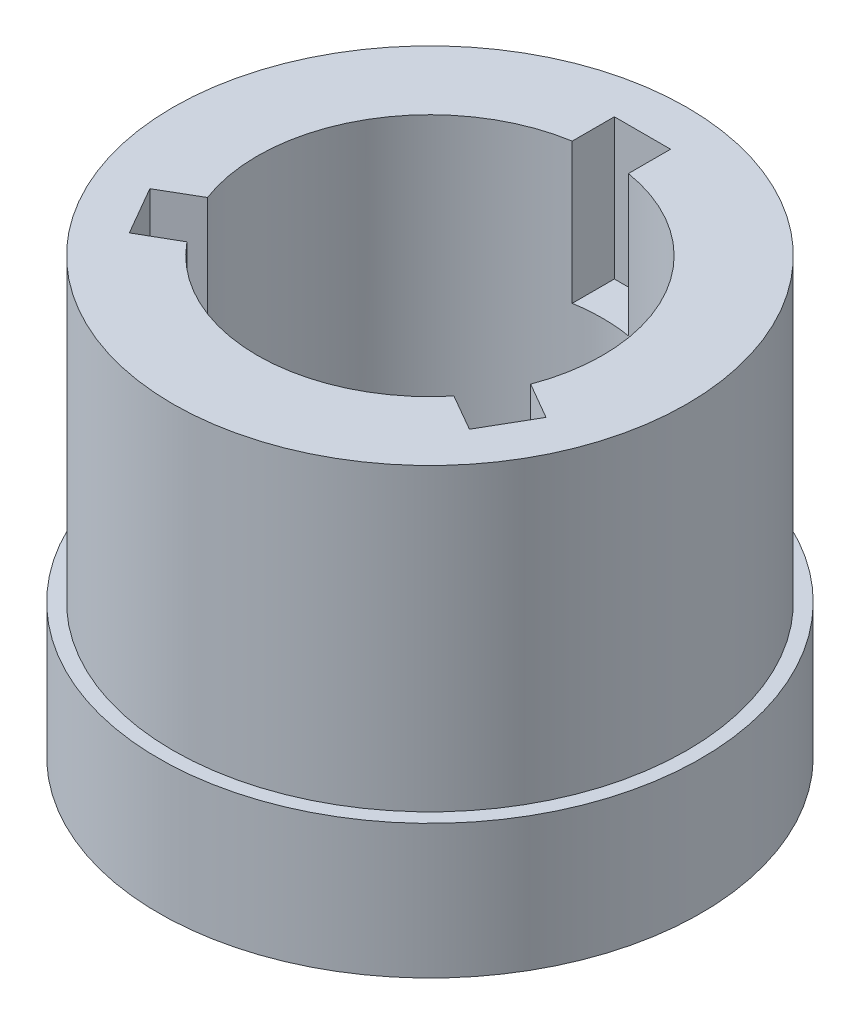
ISO-10303-21;
HEADER;
FILE_DESCRIPTION(('STEP AP214'),'2;1');
FILE_NAME('part.step','',(''),(''),'','','');
FILE_SCHEMA(('AUTOMOTIVE_DESIGN { 1 0 10303 214 1 1 1 1 }'));
ENDSEC;
DATA;
#1=APPLICATION_CONTEXT('core data for automotive mechanical design processes');
#2=APPLICATION_PROTOCOL_DEFINITION('international standard','automotive_design',2000,#1);
#3=PRODUCT_CONTEXT('',#1,'mechanical');
#4=PRODUCT('Part','Part','',(#3));
#5=PRODUCT_RELATED_PRODUCT_CATEGORY('part','',(#4));
#6=PRODUCT_DEFINITION_FORMATION('','',#4);
#7=PRODUCT_DEFINITION_CONTEXT('part definition',#1,'design');
#8=PRODUCT_DEFINITION('design','',#6,#7);
#9=PRODUCT_DEFINITION_SHAPE('','',#8);
#10=(LENGTH_UNIT() NAMED_UNIT(*) SI_UNIT(.MILLI.,.METRE.));
#11=(NAMED_UNIT(*) PLANE_ANGLE_UNIT() SI_UNIT($,.RADIAN.));
#12=(NAMED_UNIT(*) SI_UNIT($,.STERADIAN.) SOLID_ANGLE_UNIT());
#13=UNCERTAINTY_MEASURE_WITH_UNIT(LENGTH_MEASURE(1.E-05),#10,'distance_accuracy_value','');
#14=(GEOMETRIC_REPRESENTATION_CONTEXT(3) GLOBAL_UNCERTAINTY_ASSIGNED_CONTEXT((#13)) GLOBAL_UNIT_ASSIGNED_CONTEXT((#10,
#11,#12)) REPRESENTATION_CONTEXT('',''));
#15=CARTESIAN_POINT('',(0.,0.,0.));
#16=DIRECTION('',(0.,0.,1.));
#17=DIRECTION('',(1.,0.,0.));
#18=AXIS2_PLACEMENT_3D('',#15,#16,#17);
#19=CARTESIAN_POINT('',(0.,-29.4383234168354,0.));
#20=DIRECTION('',(0.,-1.,0.));
#21=DIRECTION('',(0.,0.,-1.));
#22=AXIS2_PLACEMENT_3D('',#19,#20,#21);
#23=DEGENERATE_TOROIDAL_SURFACE('',#22,14.4033473019353,16.3209518177761,.T.);
#24=CARTESIAN_POINT('',(0.,-29.4383234168354,0.));
#25=DIRECTION('',(0.,-1.,0.));
#26=DIRECTION('',(0.,0.,-1.));
#27=AXIS2_PLACEMENT_3D('',#24,#25,#26);
#28=CIRCLE('',#27,30.7242991197115);
#29=CARTESIAN_POINT('',(0.,-29.4383234168354,-30.7242991197115));
#30=VERTEX_POINT('',#29);
#31=EDGE_CURVE('E11',#30,#30,#28,.T.);
#32=ORIENTED_EDGE('',*,*,#31,.F.);
#33=EDGE_LOOP('',(#32));
#34=FACE_BOUND('',#33,.T.);
#35=CARTESIAN_POINT('',(0.,-43.1701942750485,0.));
#36=DIRECTION('',(0.,-1.,0.));
#37=DIRECTION('',(0.,0.,-1.));
#38=AXIS2_PLACEMENT_3D('',#35,#36,#37);
#39=CIRCLE('',#38,23.2242991197115);
#40=CARTESIAN_POINT('',(0.,-43.1701942750485,-23.2242991197115));
#41=VERTEX_POINT('',#40);
#42=EDGE_CURVE('E262',#41,#41,#39,.T.);
#43=ORIENTED_EDGE('',*,*,#42,.T.);
#44=EDGE_LOOP('',(#43));
#45=FACE_BOUND('',#44,.T.);
#46=ADVANCED_FACE('F45',(#34,#45),#23,.F.);
#47=CARTESIAN_POINT('',(0.,0.,0.));
#48=DIRECTION('',(0.,-1.,0.));
#49=DIRECTION('',(0.,0.,-1.));
#50=AXIS2_PLACEMENT_3D('',#47,#48,#49);
#51=CYLINDRICAL_SURFACE('',#50,30.7242991197115);
#52=CARTESIAN_POINT('',(0.,41.8298057249515,0.));
#53=DIRECTION('',(0.,1.,0.));
#54=DIRECTION('',(0.,0.,1.));
#55=AXIS2_PLACEMENT_3D('',#52,#53,#54);
#56=CIRCLE('',#55,30.7242991197115);
#57=CARTESIAN_POINT('',(28.7533220240434,41.8298057249515,10.8272355187814));
#58=VERTEX_POINT('',#57);
#59=CARTESIAN_POINT('',(4.99999999999999,41.8298057249515,-30.3147250754069));
#60=VERTEX_POINT('',#59);
#61=EDGE_CURVE('E261',#58,#60,#56,.T.);
#62=ORIENTED_EDGE('',*,*,#61,.T.);
#63=DIRECTION('',(0.,1.,0.));
#64=VECTOR('',#63,1.);
#65=CARTESIAN_POINT('',(4.99999999999999,16.8298057249515,-30.3147250754069));
#66=LINE('',#65,#64);
#67=CARTESIAN_POINT('',(4.99999999999999,16.8298057249515,-30.3147250754069));
#68=VERTEX_POINT('',#67);
#69=EDGE_CURVE('E176',#68,#60,#66,.T.);
#70=ORIENTED_EDGE('',*,*,#69,.F.);
#71=CARTESIAN_POINT('',(0.,16.8298057249515,0.));
#72=DIRECTION('',(0.,-1.,0.));
#73=DIRECTION('',(0.,0.,1.));
#74=AXIS2_PLACEMENT_3D('',#71,#72,#73);
#75=CIRCLE('',#74,30.7242991197115);
#76=CARTESIAN_POINT('',(-5.00000000000001,16.8298057249515,-30.3147250754069));
#77=VERTEX_POINT('',#76);
#78=EDGE_CURVE('E151',#77,#68,#75,.T.);
#79=ORIENTED_EDGE('',*,*,#78,.F.);
#80=DIRECTION('',(0.,1.,0.));
#81=VECTOR('',#80,1.);
#82=CARTESIAN_POINT('',(-5.00000000000001,16.8298057249515,-30.3147250754069));
#83=LINE('',#82,#81);
#84=CARTESIAN_POINT('',(-5.00000000000001,41.8298057249515,-30.3147250754069));
#85=VERTEX_POINT('',#84);
#86=EDGE_CURVE('E141',#77,#85,#83,.T.);
#87=ORIENTED_EDGE('',*,*,#86,.T.);
#88=CARTESIAN_POINT('',(-28.7533220240436,41.8298057249515,10.827235518781));
#89=VERTEX_POINT('',#88);
#90=EDGE_CURVE('E260',#85,#89,#56,.T.);
#91=ORIENTED_EDGE('',*,*,#90,.T.);
#92=DIRECTION('',(0.,1.,0.));
#93=VECTOR('',#92,1.);
#94=CARTESIAN_POINT('',(-28.7533220240436,16.8298057249515,10.827235518781));
#95=LINE('',#94,#93);
#96=CARTESIAN_POINT('',(-28.7533220240436,16.8298057249515,10.827235518781));
#97=VERTEX_POINT('',#96);
#98=EDGE_CURVE('E181',#97,#89,#95,.T.);
#99=ORIENTED_EDGE('',*,*,#98,.F.);
#100=CARTESIAN_POINT('',(0.,16.8298057249515,0.));
#101=DIRECTION('',(0.,-1.,0.));
#102=DIRECTION('',(0.,0.,1.));
#103=AXIS2_PLACEMENT_3D('',#100,#101,#102);
#104=CIRCLE('',#103,30.7242991197115);
#105=CARTESIAN_POINT('',(-23.7533220240437,16.8298057249515,19.4874895566254));
#106=VERTEX_POINT('',#105);
#107=EDGE_CURVE('E199',#106,#97,#104,.T.);
#108=ORIENTED_EDGE('',*,*,#107,.F.);
#109=DIRECTION('',(0.,1.,0.));
#110=VECTOR('',#109,1.);
#111=CARTESIAN_POINT('',(-23.7533220240437,16.8298057249515,19.4874895566254));
#112=LINE('',#111,#110);
#113=CARTESIAN_POINT('',(-23.7533220240437,41.8298057249515,19.4874895566254));
#114=VERTEX_POINT('',#113);
#115=EDGE_CURVE('E191',#106,#114,#112,.T.);
#116=ORIENTED_EDGE('',*,*,#115,.T.);
#117=CARTESIAN_POINT('',(23.7533220240434,41.8298057249515,19.4874895566257));
#118=VERTEX_POINT('',#117);
#119=EDGE_CURVE('E175',#114,#118,#56,.T.);
#120=ORIENTED_EDGE('',*,*,#119,.T.);
#121=DIRECTION('',(0.,1.,0.));
#122=VECTOR('',#121,1.);
#123=CARTESIAN_POINT('',(23.7533220240434,16.8298057249515,19.4874895566257));
#124=LINE('',#123,#122);
#125=CARTESIAN_POINT('',(23.7533220240434,16.8298057249515,19.4874895566257));
#126=VERTEX_POINT('',#125);
#127=EDGE_CURVE('E228',#126,#118,#124,.T.);
#128=ORIENTED_EDGE('',*,*,#127,.F.);
#129=CARTESIAN_POINT('',(0.,16.8298057249515,0.));
#130=DIRECTION('',(0.,-1.,0.));
#131=DIRECTION('',(0.,0.,1.));
#132=AXIS2_PLACEMENT_3D('',#129,#130,#131);
#133=CIRCLE('',#132,30.7242991197115);
#134=CARTESIAN_POINT('',(28.7533220240434,16.8298057249515,10.8272355187814));
#135=VERTEX_POINT('',#134);
#136=EDGE_CURVE('E247',#135,#126,#133,.T.);
#137=ORIENTED_EDGE('',*,*,#136,.F.);
#138=DIRECTION('',(0.,1.,0.));
#139=VECTOR('',#138,1.);
#140=CARTESIAN_POINT('',(28.7533220240434,16.8298057249515,10.8272355187814));
#141=LINE('',#140,#139);
#142=EDGE_CURVE('E224',#135,#58,#141,.T.);
#143=ORIENTED_EDGE('',*,*,#142,.T.);
#144=EDGE_LOOP('',(#62,#70,#79,#87,#91,#99,#108,#116,#120,#128,#137,#143));
#145=FACE_BOUND('',#144,.T.);
#146=ORIENTED_EDGE('',*,*,#31,.T.);
#147=EDGE_LOOP('',(#146));
#148=FACE_BOUND('',#147,.T.);
#149=ADVANCED_FACE('F290',(#145,#148),#51,.F.);
#150=CARTESIAN_POINT('',(-45.7242991197115,41.8298057249515,0.));
#151=DIRECTION('',(0.,-1.,0.));
#152=DIRECTION('',(0.,0.,-1.));
#153=AXIS2_PLACEMENT_3D('',#150,#151,#152);
#154=PLANE('',#153);
#155=CARTESIAN_POINT('',(0.,41.8298057249515,0.));
#156=DIRECTION('',(0.,-1.,0.));
#157=DIRECTION('',(0.,0.,-1.));
#158=AXIS2_PLACEMENT_3D('',#155,#156,#157);
#159=CIRCLE('',#158,45.7242991197115);
#160=CARTESIAN_POINT('',(0.,41.8298057249515,-45.7242991197115));
#161=VERTEX_POINT('',#160);
#162=EDGE_CURVE('E53',#161,#161,#159,.T.);
#163=ORIENTED_EDGE('',*,*,#162,.F.);
#164=EDGE_LOOP('',(#163));
#165=FACE_BOUND('',#164,.T.);
#166=DIRECTION('',(-1.,0.,0.));
#167=VECTOR('',#166,1.);
#168=CARTESIAN_POINT('',(-5.00000000000001,41.8298057249515,-37.8147250754069));
#169=LINE('',#168,#167);
#170=CARTESIAN_POINT('',(4.99999999999999,41.8298057249515,-37.8147250754069));
#171=VERTEX_POINT('',#170);
#172=CARTESIAN_POINT('',(-5.00000000000001,41.8298057249515,-37.8147250754069));
#173=VERTEX_POINT('',#172);
#174=EDGE_CURVE('E60',#171,#173,#169,.T.);
#175=ORIENTED_EDGE('',*,*,#174,.F.);
#176=DIRECTION('',(0.,0.,-1.));
#177=VECTOR('',#176,1.);
#178=CARTESIAN_POINT('',(4.99999999999999,41.8298057249515,-37.8147250754069));
#179=LINE('',#178,#177);
#180=EDGE_CURVE('E156',#60,#171,#179,.T.);
#181=ORIENTED_EDGE('',*,*,#180,.F.);
#182=ORIENTED_EDGE('',*,*,#61,.F.);
#183=DIRECTION('',(-0.86532314527106,0.,-0.501214379540532));
#184=VECTOR('',#183,1.);
#185=CARTESIAN_POINT('',(35.2444547190793,41.8298057249515,14.5870437060898));
#186=LINE('',#185,#184);
#187=CARTESIAN_POINT('',(35.2444547190793,41.8298057249515,14.5870437060898));
#188=VERTEX_POINT('',#187);
#189=EDGE_CURVE('E238',#188,#58,#186,.T.);
#190=ORIENTED_EDGE('',*,*,#189,.F.);
#191=DIRECTION('',(0.500000000000004,0.,-0.866025403784436));
#192=VECTOR('',#191,1.);
#193=CARTESIAN_POINT('',(30.2549777751271,41.8298057249515,23.2290712762083));
#194=LINE('',#193,#192);
#195=CARTESIAN_POINT('',(30.2549777751271,41.8298057249515,23.2290712762083));
#196=VERTEX_POINT('',#195);
#197=EDGE_CURVE('E68',#196,#188,#194,.T.);
#198=ORIENTED_EDGE('',*,*,#197,.F.);
#199=DIRECTION('',(0.866725958059682,0.,0.498784636517131));
#200=VECTOR('',#199,1.);
#201=CARTESIAN_POINT('',(30.2549777751271,41.8298057249515,23.2290712762083));
#202=LINE('',#201,#200);
#203=EDGE_CURVE('E234',#118,#196,#202,.T.);
#204=ORIENTED_EDGE('',*,*,#203,.F.);
#205=ORIENTED_EDGE('',*,*,#119,.F.);
#206=DIRECTION('',(0.866725958059689,0.,-0.49878463651712));
#207=VECTOR('',#206,1.);
#208=CARTESIAN_POINT('',(-30.2549777751275,41.8298057249515,23.2290712762079));
#209=LINE('',#208,#207);
#210=CARTESIAN_POINT('',(-30.2549777751275,41.8298057249515,23.2290712762079));
#211=VERTEX_POINT('',#210);
#212=EDGE_CURVE('E195',#211,#114,#209,.T.);
#213=ORIENTED_EDGE('',*,*,#212,.F.);
#214=DIRECTION('',(0.499999999999992,0.,0.866025403784443));
#215=VECTOR('',#214,1.);
#216=CARTESIAN_POINT('',(-30.2549777751275,41.8298057249515,23.2290712762079));
#217=LINE('',#216,#215);
#218=CARTESIAN_POINT('',(-35.2444547190795,41.8298057249515,14.5870437060894));
#219=VERTEX_POINT('',#218);
#220=EDGE_CURVE('E198',#219,#211,#217,.T.);
#221=ORIENTED_EDGE('',*,*,#220,.F.);
#222=DIRECTION('',(-0.865323145271066,0.,0.501214379540521));
#223=VECTOR('',#222,1.);
#224=CARTESIAN_POINT('',(-35.2444547190795,41.8298057249515,14.5870437060894));
#225=LINE('',#224,#223);
#226=EDGE_CURVE('E169',#89,#219,#225,.T.);
#227=ORIENTED_EDGE('',*,*,#226,.F.);
#228=ORIENTED_EDGE('',*,*,#90,.F.);
#229=DIRECTION('',(0.,0.,1.));
#230=VECTOR('',#229,1.);
#231=CARTESIAN_POINT('',(-5.00000000000001,41.8298057249515,-37.8147250754069));
#232=LINE('',#231,#230);
#233=EDGE_CURVE('E160',#173,#85,#232,.T.);
#234=ORIENTED_EDGE('',*,*,#233,.F.);
#235=EDGE_LOOP('',(#175,#181,#182,#190,#198,#204,#205,#213,#221,#227,#228,#234));
#236=FACE_BOUND('',#235,.T.);
#237=ADVANCED_FACE('F287',(#165,#236),#154,.F.);
#238=CARTESIAN_POINT('',(0.,0.,0.));
#239=DIRECTION('',(0.,-1.,0.));
#240=DIRECTION('',(0.,0.,-1.));
#241=AXIS2_PLACEMENT_3D('',#238,#239,#240);
#242=CYLINDRICAL_SURFACE('',#241,45.7242991197115);
#243=CARTESIAN_POINT('',(0.,-11.5424413358201,0.));
#244=DIRECTION('',(0.,-1.,0.));
#245=DIRECTION('',(0.,0.,-1.));
#246=AXIS2_PLACEMENT_3D('',#243,#244,#245);
#247=CIRCLE('',#246,45.7242991197115);
#248=CARTESIAN_POINT('',(0.,-11.5424413358201,-45.7242991197115));
#249=VERTEX_POINT('',#248);
#250=EDGE_CURVE('E278',#249,#249,#247,.T.);
#251=ORIENTED_EDGE('',*,*,#250,.F.);
#252=EDGE_LOOP('',(#251));
#253=FACE_BOUND('',#252,.T.);
#254=ORIENTED_EDGE('',*,*,#162,.T.);
#255=EDGE_LOOP('',(#254));
#256=FACE_BOUND('',#255,.T.);
#257=ADVANCED_FACE('F285',(#253,#256),#242,.T.);
#258=CARTESIAN_POINT('',(-48.2242991197115,-11.5424413358201,0.));
#259=DIRECTION('',(0.,-1.,0.));
#260=DIRECTION('',(0.,0.,-1.));
#261=AXIS2_PLACEMENT_3D('',#258,#259,#260);
#262=PLANE('',#261);
#263=CARTESIAN_POINT('',(0.,-11.5424413358201,0.));
#264=DIRECTION('',(0.,-1.,0.));
#265=DIRECTION('',(0.,0.,-1.));
#266=AXIS2_PLACEMENT_3D('',#263,#264,#265);
#267=CIRCLE('',#266,48.2242991197115);
#268=CARTESIAN_POINT('',(0.,-11.5424413358201,-48.2242991197115));
#269=VERTEX_POINT('',#268);
#270=EDGE_CURVE('E274',#269,#269,#267,.T.);
#271=ORIENTED_EDGE('',*,*,#270,.F.);
#272=EDGE_LOOP('',(#271));
#273=FACE_BOUND('',#272,.T.);
#274=ORIENTED_EDGE('',*,*,#250,.T.);
#275=EDGE_LOOP('',(#274));
#276=FACE_BOUND('',#275,.T.);
#277=ADVANCED_FACE('F340',(#273,#276),#262,.F.);
#278=CARTESIAN_POINT('',(0.,0.,0.));
#279=DIRECTION('',(0.,-1.,0.));
#280=DIRECTION('',(0.,0.,-1.));
#281=AXIS2_PLACEMENT_3D('',#278,#279,#280);
#282=CYLINDRICAL_SURFACE('',#281,48.2242991197115);
#283=CARTESIAN_POINT('',(0.,-35.3812391500278,0.));
#284=DIRECTION('',(0.,-1.,0.));
#285=DIRECTION('',(0.,0.,-1.));
#286=AXIS2_PLACEMENT_3D('',#283,#284,#285);
#287=CIRCLE('',#286,48.2242991197115);
#288=CARTESIAN_POINT('',(0.,-35.3812391500278,-48.2242991197115));
#289=VERTEX_POINT('',#288);
#290=EDGE_CURVE('E270',#289,#289,#287,.T.);
#291=ORIENTED_EDGE('',*,*,#290,.F.);
#292=EDGE_LOOP('',(#291));
#293=FACE_BOUND('',#292,.T.);
#294=ORIENTED_EDGE('',*,*,#270,.T.);
#295=EDGE_LOOP('',(#294));
#296=FACE_BOUND('',#295,.T.);
#297=ADVANCED_FACE('F334',(#293,#296),#282,.T.);
#298=CARTESIAN_POINT('',(0.,-35.3812391500278,0.));
#299=DIRECTION('',(0.,1.,0.));
#300=DIRECTION('',(0.,0.,1.));
#301=AXIS2_PLACEMENT_3D('',#298,#299,#300);
#302=CONICAL_SURFACE('',#301,48.2242991197115,1.15203877160203);
#303=CARTESIAN_POINT('',(0.,-43.1701942750485,0.));
#304=DIRECTION('',(0.,-1.,0.));
#305=DIRECTION('',(0.,0.,-1.));
#306=AXIS2_PLACEMENT_3D('',#303,#304,#305);
#307=CIRCLE('',#306,30.7242991197115);
#308=CARTESIAN_POINT('',(0.,-43.1701942750485,-30.7242991197115));
#309=VERTEX_POINT('',#308);
#310=EDGE_CURVE('E266',#309,#309,#307,.T.);
#311=ORIENTED_EDGE('',*,*,#310,.F.);
#312=EDGE_LOOP('',(#311));
#313=FACE_BOUND('',#312,.T.);
#314=ORIENTED_EDGE('',*,*,#290,.T.);
#315=EDGE_LOOP('',(#314));
#316=FACE_BOUND('',#315,.T.);
#317=ADVANCED_FACE('F328',(#313,#316),#302,.T.);
#318=CARTESIAN_POINT('',(-23.2242991197115,-43.1701942750485,0.));
#319=DIRECTION('',(0.,1.,0.));
#320=DIRECTION('',(0.,0.,1.));
#321=AXIS2_PLACEMENT_3D('',#318,#319,#320);
#322=PLANE('',#321);
#323=ORIENTED_EDGE('',*,*,#42,.F.);
#324=EDGE_LOOP('',(#323));
#325=FACE_BOUND('',#324,.T.);
#326=ORIENTED_EDGE('',*,*,#310,.T.);
#327=EDGE_LOOP('',(#326));
#328=FACE_BOUND('',#327,.T.);
#329=ADVANCED_FACE('F324',(#325,#328),#322,.F.);
#330=CARTESIAN_POINT('',(30.2549777751271,16.8298057249515,23.2290712762083));
#331=DIRECTION('',(0.866025403784436,0.,0.500000000000004));
#332=DIRECTION('',(0.500000000000004,0.,-0.866025403784436));
#333=AXIS2_PLACEMENT_3D('',#330,#331,#332);
#334=PLANE('',#333);
#335=ORIENTED_EDGE('',*,*,#197,.T.);
#336=DIRECTION('',(0.,1.,0.));
#337=VECTOR('',#336,1.);
#338=CARTESIAN_POINT('',(35.2444547190793,16.8298057249515,14.5870437060898));
#339=LINE('',#338,#337);
#340=CARTESIAN_POINT('',(35.2444547190793,16.8298057249515,14.5870437060898));
#341=VERTEX_POINT('',#340);
#342=EDGE_CURVE('E220',#341,#188,#339,.T.);
#343=ORIENTED_EDGE('',*,*,#342,.F.);
#344=DIRECTION('',(0.500000000000004,0.,-0.866025403784436));
#345=VECTOR('',#344,1.);
#346=CARTESIAN_POINT('',(30.2549777751271,16.8298057249515,23.2290712762083));
#347=LINE('',#346,#345);
#348=CARTESIAN_POINT('',(30.2549777751271,16.8298057249515,23.2290712762083));
#349=VERTEX_POINT('',#348);
#350=EDGE_CURVE('E239',#349,#341,#347,.T.);
#351=ORIENTED_EDGE('',*,*,#350,.F.);
#352=DIRECTION('',(0.,1.,0.));
#353=VECTOR('',#352,1.);
#354=CARTESIAN_POINT('',(30.2549777751271,16.8298057249515,23.2290712762083));
#355=LINE('',#354,#353);
#356=EDGE_CURVE('E231',#349,#196,#355,.T.);
#357=ORIENTED_EDGE('',*,*,#356,.T.);
#358=EDGE_LOOP('',(#335,#343,#351,#357));
#359=FACE_BOUND('',#358,.T.);
#360=ADVANCED_FACE('F327',(#359),#334,.F.);
#361=CARTESIAN_POINT('',(30.2549777751271,16.8298057249515,23.2290712762083));
#362=DIRECTION('',(-0.498784636517131,0.,0.866725958059682));
#363=DIRECTION('',(0.866725958059682,0.,0.498784636517131));
#364=AXIS2_PLACEMENT_3D('',#361,#362,#363);
#365=PLANE('',#364);
#366=ORIENTED_EDGE('',*,*,#203,.T.);
#367=ORIENTED_EDGE('',*,*,#356,.F.);
#368=DIRECTION('',(0.866725958059682,0.,0.498784636517131));
#369=VECTOR('',#368,1.);
#370=CARTESIAN_POINT('',(30.2549777751271,16.8298057249515,23.2290712762083));
#371=LINE('',#370,#369);
#372=EDGE_CURVE('E223',#126,#349,#371,.T.);
#373=ORIENTED_EDGE('',*,*,#372,.F.);
#374=ORIENTED_EDGE('',*,*,#127,.T.);
#375=EDGE_LOOP('',(#366,#367,#373,#374));
#376=FACE_BOUND('',#375,.T.);
#377=ADVANCED_FACE('F359',(#376),#365,.F.);
#378=CARTESIAN_POINT('',(35.2444547190793,16.8298057249515,14.5870437060898));
#379=DIRECTION('',(0.501214379540532,0.,-0.86532314527106));
#380=DIRECTION('',(-0.86532314527106,0.,-0.501214379540532));
#381=AXIS2_PLACEMENT_3D('',#378,#379,#380);
#382=PLANE('',#381);
#383=ORIENTED_EDGE('',*,*,#189,.T.);
#384=ORIENTED_EDGE('',*,*,#142,.F.);
#385=DIRECTION('',(-0.86532314527106,0.,-0.501214379540532));
#386=VECTOR('',#385,1.);
#387=CARTESIAN_POINT('',(35.2444547190793,16.8298057249515,14.5870437060898));
#388=LINE('',#387,#386);
#389=EDGE_CURVE('E250',#341,#135,#388,.T.);
#390=ORIENTED_EDGE('',*,*,#389,.F.);
#391=ORIENTED_EDGE('',*,*,#342,.T.);
#392=EDGE_LOOP('',(#383,#384,#390,#391));
#393=FACE_BOUND('',#392,.T.);
#394=ADVANCED_FACE('F357',(#393),#382,.F.);
#395=CARTESIAN_POINT('',(0.,16.8298057249515,0.));
#396=DIRECTION('',(0.,1.,0.));
#397=DIRECTION('',(0.,0.,1.));
#398=AXIS2_PLACEMENT_3D('',#395,#396,#397);
#399=PLANE('',#398);
#400=ORIENTED_EDGE('',*,*,#350,.T.);
#401=ORIENTED_EDGE('',*,*,#389,.T.);
#402=ORIENTED_EDGE('',*,*,#136,.T.);
#403=ORIENTED_EDGE('',*,*,#372,.T.);
#404=EDGE_LOOP('',(#400,#401,#402,#403));
#405=FACE_BOUND('',#404,.T.);
#406=ADVANCED_FACE('F353',(#405),#399,.T.);
#407=CARTESIAN_POINT('',(-30.2549777751275,16.8298057249515,23.2290712762079));
#408=DIRECTION('',(0.49878463651712,0.,0.866725958059689));
#409=DIRECTION('',(0.866725958059689,0.,-0.49878463651712));
#410=AXIS2_PLACEMENT_3D('',#407,#408,#409);
#411=PLANE('',#410);
#412=ORIENTED_EDGE('',*,*,#212,.T.);
#413=ORIENTED_EDGE('',*,*,#115,.F.);
#414=DIRECTION('',(0.866725958059689,0.,-0.49878463651712));
#415=VECTOR('',#414,1.);
#416=CARTESIAN_POINT('',(-30.2549777751275,16.8298057249515,23.2290712762079));
#417=LINE('',#416,#415);
#418=CARTESIAN_POINT('',(-30.2549777751275,16.8298057249515,23.2290712762079));
#419=VERTEX_POINT('',#418);
#420=EDGE_CURVE('E184',#419,#106,#417,.T.);
#421=ORIENTED_EDGE('',*,*,#420,.F.);
#422=DIRECTION('',(0.,1.,0.));
#423=VECTOR('',#422,1.);
#424=CARTESIAN_POINT('',(-30.2549777751275,16.8298057249515,23.2290712762079));
#425=LINE('',#424,#423);
#426=EDGE_CURVE('E188',#419,#211,#425,.T.);
#427=ORIENTED_EDGE('',*,*,#426,.T.);
#428=EDGE_LOOP('',(#412,#413,#421,#427));
#429=FACE_BOUND('',#428,.T.);
#430=ADVANCED_FACE('F356',(#429),#411,.F.);
#431=CARTESIAN_POINT('',(-30.2549777751275,16.8298057249515,23.2290712762079));
#432=DIRECTION('',(-0.866025403784443,0.,0.499999999999992));
#433=DIRECTION('',(0.499999999999992,0.,0.866025403784443));
#434=AXIS2_PLACEMENT_3D('',#431,#432,#433);
#435=PLANE('',#434);
#436=ORIENTED_EDGE('',*,*,#220,.T.);
#437=ORIENTED_EDGE('',*,*,#426,.F.);
#438=DIRECTION('',(0.499999999999992,0.,0.866025403784443));
#439=VECTOR('',#438,1.);
#440=CARTESIAN_POINT('',(-30.2549777751275,16.8298057249515,23.2290712762079));
#441=LINE('',#440,#439);
#442=CARTESIAN_POINT('',(-35.2444547190795,16.8298057249515,14.5870437060894));
#443=VERTEX_POINT('',#442);
#444=EDGE_CURVE('E209',#443,#419,#441,.T.);
#445=ORIENTED_EDGE('',*,*,#444,.F.);
#446=DIRECTION('',(0.,1.,0.));
#447=VECTOR('',#446,1.);
#448=CARTESIAN_POINT('',(-35.2444547190795,16.8298057249515,14.5870437060894));
#449=LINE('',#448,#447);
#450=EDGE_CURVE('E185',#443,#219,#449,.T.);
#451=ORIENTED_EDGE('',*,*,#450,.T.);
#452=EDGE_LOOP('',(#436,#437,#445,#451));
#453=FACE_BOUND('',#452,.T.);
#454=ADVANCED_FACE('F374',(#453),#435,.F.);
#455=CARTESIAN_POINT('',(-35.2444547190795,16.8298057249515,14.5870437060894));
#456=DIRECTION('',(-0.501214379540521,0.,-0.865323145271066));
#457=DIRECTION('',(-0.865323145271066,0.,0.501214379540521));
#458=AXIS2_PLACEMENT_3D('',#455,#456,#457);
#459=PLANE('',#458);
#460=ORIENTED_EDGE('',*,*,#226,.T.);
#461=ORIENTED_EDGE('',*,*,#450,.F.);
#462=DIRECTION('',(-0.865323145271066,0.,0.501214379540521));
#463=VECTOR('',#462,1.);
#464=CARTESIAN_POINT('',(-35.2444547190795,16.8298057249515,14.5870437060894));
#465=LINE('',#464,#463);
#466=EDGE_CURVE('E213',#97,#443,#465,.T.);
#467=ORIENTED_EDGE('',*,*,#466,.F.);
#468=ORIENTED_EDGE('',*,*,#98,.T.);
#469=EDGE_LOOP('',(#460,#461,#467,#468));
#470=FACE_BOUND('',#469,.T.);
#471=ADVANCED_FACE('F370',(#470),#459,.F.);
#472=CARTESIAN_POINT('',(0.,16.8298057249515,0.));
#473=DIRECTION('',(0.,1.,0.));
#474=DIRECTION('',(0.,0.,1.));
#475=AXIS2_PLACEMENT_3D('',#472,#473,#474);
#476=PLANE('',#475);
#477=ORIENTED_EDGE('',*,*,#107,.T.);
#478=ORIENTED_EDGE('',*,*,#466,.T.);
#479=ORIENTED_EDGE('',*,*,#444,.T.);
#480=ORIENTED_EDGE('',*,*,#420,.T.);
#481=EDGE_LOOP('',(#477,#478,#479,#480));
#482=FACE_BOUND('',#481,.T.);
#483=ADVANCED_FACE('F311',(#482),#476,.T.);
#484=CARTESIAN_POINT('',(-5.00000000000001,16.8298057249515,-37.8147250754069));
#485=DIRECTION('',(0.,0.,-1.));
#486=DIRECTION('',(-1.,0.,0.));
#487=AXIS2_PLACEMENT_3D('',#484,#485,#486);
#488=PLANE('',#487);
#489=ORIENTED_EDGE('',*,*,#174,.T.);
#490=DIRECTION('',(0.,1.,0.));
#491=VECTOR('',#490,1.);
#492=CARTESIAN_POINT('',(-5.00000000000001,16.8298057249515,-37.8147250754069));
#493=LINE('',#492,#491);
#494=CARTESIAN_POINT('',(-5.00000000000001,16.8298057249515,-37.8147250754069));
#495=VERTEX_POINT('',#494);
#496=EDGE_CURVE('E132',#495,#173,#493,.T.);
#497=ORIENTED_EDGE('',*,*,#496,.F.);
#498=DIRECTION('',(-1.,0.,0.));
#499=VECTOR('',#498,1.);
#500=CARTESIAN_POINT('',(-5.00000000000001,16.8298057249515,-37.8147250754069));
#501=LINE('',#500,#499);
#502=CARTESIAN_POINT('',(4.99999999999999,16.8298057249515,-37.8147250754069));
#503=VERTEX_POINT('',#502);
#504=EDGE_CURVE('E136',#503,#495,#501,.T.);
#505=ORIENTED_EDGE('',*,*,#504,.F.);
#506=DIRECTION('',(0.,1.,0.));
#507=VECTOR('',#506,1.);
#508=CARTESIAN_POINT('',(4.99999999999999,16.8298057249515,-37.8147250754069));
#509=LINE('',#508,#507);
#510=EDGE_CURVE('E172',#503,#171,#509,.T.);
#511=ORIENTED_EDGE('',*,*,#510,.T.);
#512=EDGE_LOOP('',(#489,#497,#505,#511));
#513=FACE_BOUND('',#512,.T.);
#514=ADVANCED_FACE('F134',(#513),#488,.F.);
#515=CARTESIAN_POINT('',(4.99999999999999,16.8298057249515,-37.8147250754069));
#516=DIRECTION('',(1.,0.,0.));
#517=DIRECTION('',(0.,0.,-1.));
#518=AXIS2_PLACEMENT_3D('',#515,#516,#517);
#519=PLANE('',#518);
#520=ORIENTED_EDGE('',*,*,#180,.T.);
#521=ORIENTED_EDGE('',*,*,#510,.F.);
#522=DIRECTION('',(0.,0.,-1.));
#523=VECTOR('',#522,1.);
#524=CARTESIAN_POINT('',(4.99999999999999,16.8298057249515,-37.8147250754069));
#525=LINE('',#524,#523);
#526=EDGE_CURVE('E142',#68,#503,#525,.T.);
#527=ORIENTED_EDGE('',*,*,#526,.F.);
#528=ORIENTED_EDGE('',*,*,#69,.T.);
#529=EDGE_LOOP('',(#520,#521,#527,#528));
#530=FACE_BOUND('',#529,.T.);
#531=ADVANCED_FACE('F303',(#530),#519,.F.);
#532=CARTESIAN_POINT('',(-5.00000000000001,16.8298057249515,-37.8147250754069));
#533=DIRECTION('',(-1.,0.,0.));
#534=DIRECTION('',(0.,0.,1.));
#535=AXIS2_PLACEMENT_3D('',#532,#533,#534);
#536=PLANE('',#535);
#537=ORIENTED_EDGE('',*,*,#233,.T.);
#538=ORIENTED_EDGE('',*,*,#86,.F.);
#539=DIRECTION('',(0.,0.,1.));
#540=VECTOR('',#539,1.);
#541=CARTESIAN_POINT('',(-5.00000000000001,16.8298057249515,-37.8147250754069));
#542=LINE('',#541,#540);
#543=EDGE_CURVE('E145',#495,#77,#542,.T.);
#544=ORIENTED_EDGE('',*,*,#543,.F.);
#545=ORIENTED_EDGE('',*,*,#496,.T.);
#546=EDGE_LOOP('',(#537,#538,#544,#545));
#547=FACE_BOUND('',#546,.T.);
#548=ADVANCED_FACE('F146',(#547),#536,.F.);
#549=CARTESIAN_POINT('',(0.,16.8298057249515,0.));
#550=DIRECTION('',(0.,1.,0.));
#551=DIRECTION('',(0.,0.,1.));
#552=AXIS2_PLACEMENT_3D('',#549,#550,#551);
#553=PLANE('',#552);
#554=ORIENTED_EDGE('',*,*,#504,.T.);
#555=ORIENTED_EDGE('',*,*,#543,.T.);
#556=ORIENTED_EDGE('',*,*,#78,.T.);
#557=ORIENTED_EDGE('',*,*,#526,.T.);
#558=EDGE_LOOP('',(#554,#555,#556,#557));
#559=FACE_BOUND('',#558,.T.);
#560=ADVANCED_FACE('F153',(#559),#553,.T.);
#561=CLOSED_SHELL('',(#46,#149,#237,#257,#277,#297,#317,#329,#360,#377,#394,#406,#430,#454,#471,
#483,#514,#531,#548,#560));
#562=MANIFOLD_SOLID_BREP('B2',#561);
#563=ADVANCED_BREP_SHAPE_REPRESENTATION('',(#18,#562),#14);
#564=SHAPE_DEFINITION_REPRESENTATION(#9,#563);
ENDSEC;
END-ISO-10303-21;
